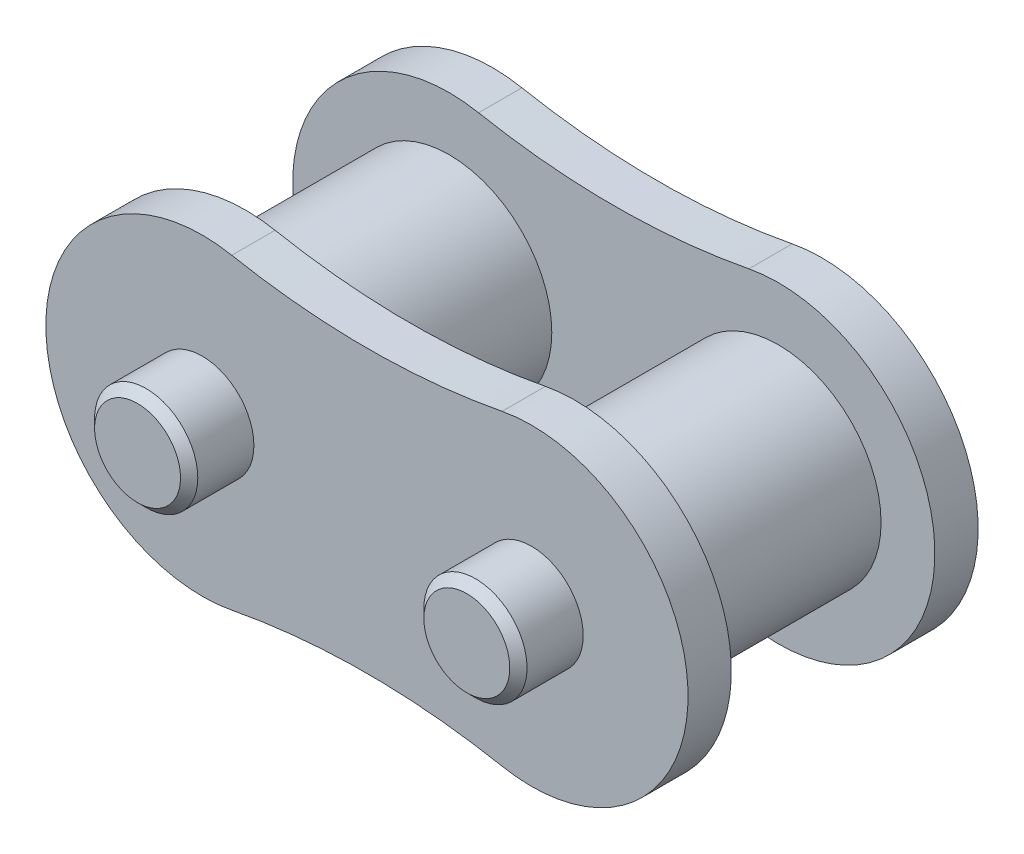
ISO-10303-21;
HEADER;
FILE_DESCRIPTION(('STEP AP214'),'2;1');
FILE_NAME('part.step','',(''),(''),'','','');
FILE_SCHEMA(('AUTOMOTIVE_DESIGN { 1 0 10303 214 1 1 1 1 }'));
ENDSEC;
DATA;
#1=APPLICATION_CONTEXT('core data for automotive mechanical design processes');
#2=APPLICATION_PROTOCOL_DEFINITION('international standard','automotive_design',2000,#1);
#3=PRODUCT_CONTEXT('',#1,'mechanical');
#4=PRODUCT('Part','Part','',(#3));
#5=PRODUCT_RELATED_PRODUCT_CATEGORY('part','',(#4));
#6=PRODUCT_DEFINITION_FORMATION('','',#4);
#7=PRODUCT_DEFINITION_CONTEXT('part definition',#1,'design');
#8=PRODUCT_DEFINITION('design','',#6,#7);
#9=PRODUCT_DEFINITION_SHAPE('','',#8);
#10=(LENGTH_UNIT() NAMED_UNIT(*) SI_UNIT(.MILLI.,.METRE.));
#11=(NAMED_UNIT(*) PLANE_ANGLE_UNIT() SI_UNIT($,.RADIAN.));
#12=(NAMED_UNIT(*) SI_UNIT($,.STERADIAN.) SOLID_ANGLE_UNIT());
#13=UNCERTAINTY_MEASURE_WITH_UNIT(LENGTH_MEASURE(1.E-05),#10,'distance_accuracy_value','');
#14=(GEOMETRIC_REPRESENTATION_CONTEXT(3) GLOBAL_UNCERTAINTY_ASSIGNED_CONTEXT((#13)) GLOBAL_UNIT_ASSIGNED_CONTEXT((#10,
#11,#12)) REPRESENTATION_CONTEXT('',''));
#15=CARTESIAN_POINT('',(0.,0.,0.));
#16=DIRECTION('',(0.,0.,1.));
#17=DIRECTION('',(1.,0.,0.));
#18=AXIS2_PLACEMENT_3D('',#15,#16,#17);
#19=CARTESIAN_POINT('',(-3.175,-16.552728976802,5.595));
#20=DIRECTION('',(0.,0.,1.));
#21=DIRECTION('',(1.,0.,0.));
#22=AXIS2_PLACEMENT_3D('',#19,#20,#21);
#23=PLANE('',#22);
#24=CARTESIAN_POINT('',(6.35,0.,5.595));
#25=DIRECTION('',(0.,0.,1.));
#26=DIRECTION('',(1.,0.,0.));
#27=AXIS2_PLACEMENT_3D('',#24,#25,#26);
#28=CIRCLE('',#27,1.99);
#29=CARTESIAN_POINT('',(8.34,0.,5.595));
#30=VERTEX_POINT('',#29);
#31=EDGE_CURVE('E186',#30,#30,#28,.T.);
#32=ORIENTED_EDGE('',*,*,#31,.F.);
#33=EDGE_LOOP('',(#32));
#34=FACE_BOUND('',#33,.T.);
#35=CARTESIAN_POINT('',(0.,-33.105457953604,5.595));
#36=DIRECTION('',(0.,0.,-1.));
#37=DIRECTION('',(1.,0.,0.));
#38=AXIS2_PLACEMENT_3D('',#35,#36,#37);
#39=CIRCLE('',#38,27.673957953604);
#40=CARTESIAN_POINT('',(-5.21314343941615,-5.92695386861222,5.595));
#41=VERTEX_POINT('',#40);
#42=CARTESIAN_POINT('',(5.21314343941615,-5.92695386861222,5.595));
#43=VERTEX_POINT('',#42);
#44=EDGE_CURVE('E191',#41,#43,#39,.T.);
#45=ORIENTED_EDGE('',*,*,#44,.T.);
#46=CARTESIAN_POINT('',(6.35,0.,5.595));
#47=DIRECTION('',(0.,0.,1.));
#48=DIRECTION('',(1.,0.,0.));
#49=AXIS2_PLACEMENT_3D('',#46,#47,#48);
#50=CIRCLE('',#49,6.03499999999999);
#51=CARTESIAN_POINT('',(5.21314343941614,5.92695386861222,5.595));
#52=VERTEX_POINT('',#51);
#53=EDGE_CURVE('E93',#43,#52,#50,.T.);
#54=ORIENTED_EDGE('',*,*,#53,.T.);
#55=CARTESIAN_POINT('',(0.,33.105457953604,5.595));
#56=DIRECTION('',(0.,0.,-1.));
#57=DIRECTION('',(1.,0.,0.));
#58=AXIS2_PLACEMENT_3D('',#55,#56,#57);
#59=CIRCLE('',#58,27.673957953604);
#60=CARTESIAN_POINT('',(-5.21314343941615,5.92695386861222,5.595));
#61=VERTEX_POINT('',#60);
#62=EDGE_CURVE('E196',#52,#61,#59,.T.);
#63=ORIENTED_EDGE('',*,*,#62,.T.);
#64=CARTESIAN_POINT('',(-6.35,0.,5.595));
#65=DIRECTION('',(0.,0.,1.));
#66=DIRECTION('',(1.,0.,0.));
#67=AXIS2_PLACEMENT_3D('',#64,#65,#66);
#68=CIRCLE('',#67,6.03499999999999);
#69=EDGE_CURVE('E61',#61,#41,#68,.T.);
#70=ORIENTED_EDGE('',*,*,#69,.T.);
#71=EDGE_LOOP('',(#45,#54,#63,#70));
#72=FACE_BOUND('',#71,.T.);
#73=CARTESIAN_POINT('',(-6.35,0.,5.595));
#74=DIRECTION('',(0.,0.,1.));
#75=DIRECTION('',(1.,0.,0.));
#76=AXIS2_PLACEMENT_3D('',#73,#74,#75);
#77=CIRCLE('',#76,1.99);
#78=CARTESIAN_POINT('',(-4.36,0.,5.595));
#79=VERTEX_POINT('',#78);
#80=EDGE_CURVE('E182',#79,#79,#77,.T.);
#81=ORIENTED_EDGE('',*,*,#80,.F.);
#82=EDGE_LOOP('',(#81));
#83=FACE_BOUND('',#82,.T.);
#84=ADVANCED_FACE('F43',(#34,#72,#83),#23,.T.);
#85=CARTESIAN_POINT('',(-3.175,-16.552728976802,3.925));
#86=DIRECTION('',(0.,0.,1.));
#87=DIRECTION('',(1.,0.,0.));
#88=AXIS2_PLACEMENT_3D('',#85,#86,#87);
#89=PLANE('',#88);
#90=CARTESIAN_POINT('',(0.,-33.105457953604,3.925));
#91=DIRECTION('',(0.,0.,-1.));
#92=DIRECTION('',(1.,0.,0.));
#93=AXIS2_PLACEMENT_3D('',#90,#91,#92);
#94=CIRCLE('',#93,27.673957953604);
#95=CARTESIAN_POINT('',(-5.21314343941615,-5.92695386861222,3.925));
#96=VERTEX_POINT('',#95);
#97=CARTESIAN_POINT('',(5.21314343941615,-5.92695386861222,3.925));
#98=VERTEX_POINT('',#97);
#99=EDGE_CURVE('E190',#96,#98,#94,.T.);
#100=ORIENTED_EDGE('',*,*,#99,.F.);
#101=CARTESIAN_POINT('',(-6.35,0.,3.925));
#102=DIRECTION('',(0.,0.,1.));
#103=DIRECTION('',(1.,0.,0.));
#104=AXIS2_PLACEMENT_3D('',#101,#102,#103);
#105=CIRCLE('',#104,6.03499999999999);
#106=CARTESIAN_POINT('',(-5.21314343941615,5.92695386861222,3.925));
#107=VERTEX_POINT('',#106);
#108=EDGE_CURVE('E85',#107,#96,#105,.T.);
#109=ORIENTED_EDGE('',*,*,#108,.F.);
#110=CARTESIAN_POINT('',(0.,33.105457953604,3.925));
#111=DIRECTION('',(0.,0.,-1.));
#112=DIRECTION('',(1.,0.,0.));
#113=AXIS2_PLACEMENT_3D('',#110,#111,#112);
#114=CIRCLE('',#113,27.673957953604);
#115=CARTESIAN_POINT('',(5.21314343941614,5.92695386861222,3.925));
#116=VERTEX_POINT('',#115);
#117=EDGE_CURVE('E79',#116,#107,#114,.T.);
#118=ORIENTED_EDGE('',*,*,#117,.F.);
#119=CARTESIAN_POINT('',(6.35,0.,3.925));
#120=DIRECTION('',(0.,0.,1.));
#121=DIRECTION('',(1.,0.,0.));
#122=AXIS2_PLACEMENT_3D('',#119,#120,#121);
#123=CIRCLE('',#122,6.03499999999999);
#124=EDGE_CURVE('E205',#98,#116,#123,.T.);
#125=ORIENTED_EDGE('',*,*,#124,.F.);
#126=EDGE_LOOP('',(#100,#109,#118,#125));
#127=FACE_BOUND('',#126,.T.);
#128=CARTESIAN_POINT('',(6.35,0.,3.925));
#129=DIRECTION('',(0.,0.,1.));
#130=DIRECTION('',(1.,0.,0.));
#131=AXIS2_PLACEMENT_3D('',#128,#129,#130);
#132=CIRCLE('',#131,3.96);
#133=CARTESIAN_POINT('',(10.31,0.,3.925));
#134=VERTEX_POINT('',#133);
#135=EDGE_CURVE('E223',#134,#134,#132,.T.);
#136=ORIENTED_EDGE('',*,*,#135,.T.);
#137=EDGE_LOOP('',(#136));
#138=FACE_BOUND('',#137,.T.);
#139=CARTESIAN_POINT('',(-6.35,0.,3.925));
#140=DIRECTION('',(0.,0.,1.));
#141=DIRECTION('',(1.,0.,0.));
#142=AXIS2_PLACEMENT_3D('',#139,#140,#141);
#143=CIRCLE('',#142,3.96);
#144=CARTESIAN_POINT('',(-2.39,0.,3.925));
#145=VERTEX_POINT('',#144);
#146=EDGE_CURVE('E227',#145,#145,#143,.F.);
#147=ORIENTED_EDGE('',*,*,#146,.F.);
#148=EDGE_LOOP('',(#147));
#149=FACE_BOUND('',#148,.T.);
#150=ADVANCED_FACE('F279',(#127,#138,#149),#89,.F.);
#151=CARTESIAN_POINT('',(6.35,0.,3.925));
#152=DIRECTION('',(0.,0.,-1.));
#153=DIRECTION('',(-1.,0.,0.));
#154=AXIS2_PLACEMENT_3D('',#151,#152,#153);
#155=CYLINDRICAL_SURFACE('',#154,3.96);
#156=ORIENTED_EDGE('',*,*,#135,.F.);
#157=EDGE_LOOP('',(#156));
#158=FACE_BOUND('',#157,.T.);
#159=CARTESIAN_POINT('',(6.35,0.,-3.925));
#160=DIRECTION('',(0.,0.,-1.));
#161=DIRECTION('',(-1.,0.,0.));
#162=AXIS2_PLACEMENT_3D('',#159,#160,#161);
#163=CIRCLE('',#162,3.96);
#164=CARTESIAN_POINT('',(2.39,0.,-3.925));
#165=VERTEX_POINT('',#164);
#166=EDGE_CURVE('E178',#165,#165,#163,.T.);
#167=ORIENTED_EDGE('',*,*,#166,.F.);
#168=EDGE_LOOP('',(#167));
#169=FACE_BOUND('',#168,.T.);
#170=ADVANCED_FACE('F285',(#158,#169),#155,.T.);
#171=CARTESIAN_POINT('',(0.,-33.105457953604,5.595));
#172=DIRECTION('',(0.,0.,-1.));
#173=DIRECTION('',(-1.,0.,0.));
#174=AXIS2_PLACEMENT_3D('',#171,#172,#173);
#175=CYLINDRICAL_SURFACE('',#174,27.673957953604);
#176=ORIENTED_EDGE('',*,*,#99,.T.);
#177=DIRECTION('',(0.,0.,-1.));
#178=VECTOR('',#177,1.);
#179=CARTESIAN_POINT('',(5.21314343941615,-5.92695386861222,5.595));
#180=LINE('',#179,#178);
#181=EDGE_CURVE('E220',#43,#98,#180,.T.);
#182=ORIENTED_EDGE('',*,*,#181,.F.);
#183=ORIENTED_EDGE('',*,*,#44,.F.);
#184=DIRECTION('',(0.,0.,-1.));
#185=VECTOR('',#184,1.);
#186=CARTESIAN_POINT('',(-5.21314343941615,-5.92695386861222,5.595));
#187=LINE('',#186,#185);
#188=EDGE_CURVE('E201',#41,#96,#187,.T.);
#189=ORIENTED_EDGE('',*,*,#188,.T.);
#190=EDGE_LOOP('',(#176,#182,#183,#189));
#191=FACE_BOUND('',#190,.T.);
#192=ADVANCED_FACE('F302',(#191),#175,.F.);
#193=CARTESIAN_POINT('',(6.35,0.,5.595));
#194=DIRECTION('',(0.,0.,-1.));
#195=DIRECTION('',(-1.,0.,0.));
#196=AXIS2_PLACEMENT_3D('',#193,#194,#195);
#197=CYLINDRICAL_SURFACE('',#196,6.03499999999999);
#198=ORIENTED_EDGE('',*,*,#124,.T.);
#199=DIRECTION('',(0.,0.,-1.));
#200=VECTOR('',#199,1.);
#201=CARTESIAN_POINT('',(5.21314343941614,5.92695386861222,5.595));
#202=LINE('',#201,#200);
#203=EDGE_CURVE('E217',#52,#116,#202,.T.);
#204=ORIENTED_EDGE('',*,*,#203,.F.);
#205=ORIENTED_EDGE('',*,*,#53,.F.);
#206=ORIENTED_EDGE('',*,*,#181,.T.);
#207=EDGE_LOOP('',(#198,#204,#205,#206));
#208=FACE_BOUND('',#207,.T.);
#209=ADVANCED_FACE('F299',(#208),#197,.T.);
#210=CARTESIAN_POINT('',(0.,33.105457953604,5.595));
#211=DIRECTION('',(0.,0.,-1.));
#212=DIRECTION('',(-1.,0.,0.));
#213=AXIS2_PLACEMENT_3D('',#210,#211,#212);
#214=CYLINDRICAL_SURFACE('',#213,27.673957953604);
#215=ORIENTED_EDGE('',*,*,#117,.T.);
#216=DIRECTION('',(0.,0.,-1.));
#217=VECTOR('',#216,1.);
#218=CARTESIAN_POINT('',(-5.21314343941615,5.92695386861222,5.595));
#219=LINE('',#218,#217);
#220=EDGE_CURVE('E214',#61,#107,#219,.T.);
#221=ORIENTED_EDGE('',*,*,#220,.F.);
#222=ORIENTED_EDGE('',*,*,#62,.F.);
#223=ORIENTED_EDGE('',*,*,#203,.T.);
#224=EDGE_LOOP('',(#215,#221,#222,#223));
#225=FACE_BOUND('',#224,.T.);
#226=ADVANCED_FACE('F296',(#225),#214,.F.);
#227=CARTESIAN_POINT('',(-6.35,0.,5.595));
#228=DIRECTION('',(0.,0.,-1.));
#229=DIRECTION('',(-1.,0.,0.));
#230=AXIS2_PLACEMENT_3D('',#227,#228,#229);
#231=CYLINDRICAL_SURFACE('',#230,6.03499999999999);
#232=ORIENTED_EDGE('',*,*,#108,.T.);
#233=ORIENTED_EDGE('',*,*,#188,.F.);
#234=ORIENTED_EDGE('',*,*,#69,.F.);
#235=ORIENTED_EDGE('',*,*,#220,.T.);
#236=EDGE_LOOP('',(#232,#233,#234,#235));
#237=FACE_BOUND('',#236,.T.);
#238=ADVANCED_FACE('F293',(#237),#231,.T.);
#239=CARTESIAN_POINT('',(-6.35,0.,3.925));
#240=DIRECTION('',(0.,0.,-1.));
#241=DIRECTION('',(-1.,0.,0.));
#242=AXIS2_PLACEMENT_3D('',#239,#240,#241);
#243=CYLINDRICAL_SURFACE('',#242,3.96);
#244=ORIENTED_EDGE('',*,*,#146,.T.);
#245=EDGE_LOOP('',(#244));
#246=FACE_BOUND('',#245,.T.);
#247=CARTESIAN_POINT('',(-6.35,0.,-3.925));
#248=DIRECTION('',(0.,0.,-1.));
#249=DIRECTION('',(-1.,0.,0.));
#250=AXIS2_PLACEMENT_3D('',#247,#248,#249);
#251=CIRCLE('',#250,3.96);
#252=CARTESIAN_POINT('',(-10.31,0.,-3.925));
#253=VERTEX_POINT('',#252);
#254=EDGE_CURVE('E132',#253,#253,#251,.T.);
#255=ORIENTED_EDGE('',*,*,#254,.F.);
#256=EDGE_LOOP('',(#255));
#257=FACE_BOUND('',#256,.T.);
#258=ADVANCED_FACE('F290',(#246,#257),#243,.T.);
#259=CARTESIAN_POINT('',(6.35,0.,8.0925));
#260=DIRECTION('',(0.,0.,-1.));
#261=DIRECTION('',(-1.,0.,0.));
#262=AXIS2_PLACEMENT_3D('',#259,#260,#261);
#263=CYLINDRICAL_SURFACE('',#262,1.99);
#264=CARTESIAN_POINT('',(6.35,0.,7.7595));
#265=DIRECTION('',(0.,0.,1.));
#266=DIRECTION('',(1.,0.,0.));
#267=AXIS2_PLACEMENT_3D('',#264,#265,#266);
#268=CIRCLE('',#267,1.99);
#269=CARTESIAN_POINT('',(4.36,0.,7.7595));
#270=VERTEX_POINT('',#269);
#271=EDGE_CURVE('E235',#270,#270,#268,.F.);
#272=ORIENTED_EDGE('',*,*,#271,.T.);
#273=EDGE_LOOP('',(#272));
#274=FACE_BOUND('',#273,.T.);
#275=ORIENTED_EDGE('',*,*,#31,.T.);
#276=EDGE_LOOP('',(#275));
#277=FACE_BOUND('',#276,.T.);
#278=ADVANCED_FACE('F340',(#274,#277),#263,.T.);
#279=CARTESIAN_POINT('',(6.35,0.,8.0925));
#280=DIRECTION('',(0.,0.,1.));
#281=DIRECTION('',(1.,0.,0.));
#282=AXIS2_PLACEMENT_3D('',#279,#280,#281);
#283=PLANE('',#282);
#284=CARTESIAN_POINT('',(6.35,0.,8.0925));
#285=DIRECTION('',(0.,0.,1.));
#286=DIRECTION('',(1.,0.,0.));
#287=AXIS2_PLACEMENT_3D('',#284,#285,#286);
#288=CIRCLE('',#287,1.657);
#289=CARTESIAN_POINT('',(4.693,0.,8.0925));
#290=VERTEX_POINT('',#289);
#291=EDGE_CURVE('E231',#290,#290,#288,.T.);
#292=ORIENTED_EDGE('',*,*,#291,.T.);
#293=EDGE_LOOP('',(#292));
#294=FACE_BOUND('',#293,.T.);
#295=ADVANCED_FACE('F333',(#294),#283,.T.);
#296=CARTESIAN_POINT('',(-6.35,0.,8.0925));
#297=DIRECTION('',(0.,0.,-1.));
#298=DIRECTION('',(-1.,0.,0.));
#299=AXIS2_PLACEMENT_3D('',#296,#297,#298);
#300=CYLINDRICAL_SURFACE('',#299,1.99);
#301=CARTESIAN_POINT('',(-6.35,0.,7.7595));
#302=DIRECTION('',(0.,0.,1.));
#303=DIRECTION('',(1.,0.,0.));
#304=AXIS2_PLACEMENT_3D('',#301,#302,#303);
#305=CIRCLE('',#304,1.99);
#306=CARTESIAN_POINT('',(-4.36,0.,7.7595));
#307=VERTEX_POINT('',#306);
#308=EDGE_CURVE('E243',#307,#307,#305,.F.);
#309=ORIENTED_EDGE('',*,*,#308,.T.);
#310=EDGE_LOOP('',(#309));
#311=FACE_BOUND('',#310,.T.);
#312=ORIENTED_EDGE('',*,*,#80,.T.);
#313=EDGE_LOOP('',(#312));
#314=FACE_BOUND('',#313,.T.);
#315=ADVANCED_FACE('F328',(#311,#314),#300,.T.);
#316=CARTESIAN_POINT('',(-6.35,0.,8.0925));
#317=DIRECTION('',(0.,0.,1.));
#318=DIRECTION('',(1.,0.,0.));
#319=AXIS2_PLACEMENT_3D('',#316,#317,#318);
#320=PLANE('',#319);
#321=CARTESIAN_POINT('',(-6.35,0.,8.0925));
#322=DIRECTION('',(0.,0.,1.));
#323=DIRECTION('',(1.,0.,0.));
#324=AXIS2_PLACEMENT_3D('',#321,#322,#323);
#325=CIRCLE('',#324,1.657);
#326=CARTESIAN_POINT('',(-4.693,0.,8.0925));
#327=VERTEX_POINT('',#326);
#328=EDGE_CURVE('E239',#327,#327,#325,.T.);
#329=ORIENTED_EDGE('',*,*,#328,.T.);
#330=EDGE_LOOP('',(#329));
#331=FACE_BOUND('',#330,.T.);
#332=ADVANCED_FACE('F313',(#331),#320,.T.);
#333=CARTESIAN_POINT('',(6.35,0.,8.0925));
#334=DIRECTION('',(0.,0.,-1.));
#335=DIRECTION('',(-1.,0.,0.));
#336=AXIS2_PLACEMENT_3D('',#333,#334,#335);
#337=CONICAL_SURFACE('',#336,1.657,0.785398163397443);
#338=CARTESIAN_POINT('',(4.36,0.,7.7595));
#339=CARTESIAN_POINT('',(4.36346875,0.,7.76296875));
#340=CARTESIAN_POINT('',(4.3669375,0.,7.7664375));
#341=CARTESIAN_POINT('',(4.373875,0.,7.773375));
#342=CARTESIAN_POINT('',(4.37734375,0.,7.77684375));
#343=CARTESIAN_POINT('',(4.38428125,0.,7.78378125));
#344=CARTESIAN_POINT('',(4.38775,0.,7.78725));
#345=CARTESIAN_POINT('',(4.3946875,0.,7.7941875));
#346=CARTESIAN_POINT('',(4.39815625,0.,7.79765625));
#347=CARTESIAN_POINT('',(4.40509375,0.,7.80459375));
#348=CARTESIAN_POINT('',(4.4085625,0.,7.8080625));
#349=CARTESIAN_POINT('',(4.4155,0.,7.815));
#350=CARTESIAN_POINT('',(4.41896875,0.,7.81846875));
#351=CARTESIAN_POINT('',(4.42590625,0.,7.82540625));
#352=CARTESIAN_POINT('',(4.429375,0.,7.828875));
#353=CARTESIAN_POINT('',(4.4363125,0.,7.8358125));
#354=CARTESIAN_POINT('',(4.43978125,0.,7.83928125));
#355=CARTESIAN_POINT('',(4.44671875,0.,7.84621875));
#356=CARTESIAN_POINT('',(4.4501875,0.,7.8496875));
#357=CARTESIAN_POINT('',(4.457125,0.,7.856625));
#358=CARTESIAN_POINT('',(4.46059375,0.,7.86009375));
#359=CARTESIAN_POINT('',(4.46753125,0.,7.86703125));
#360=CARTESIAN_POINT('',(4.471,0.,7.8705));
#361=CARTESIAN_POINT('',(4.4779375,0.,7.8774375));
#362=CARTESIAN_POINT('',(4.48140625,0.,7.88090625));
#363=CARTESIAN_POINT('',(4.48834375,0.,7.88784375));
#364=CARTESIAN_POINT('',(4.4918125,0.,7.8913125));
#365=CARTESIAN_POINT('',(4.49875,0.,7.89825));
#366=CARTESIAN_POINT('',(4.50221875,0.,7.90171875));
#367=CARTESIAN_POINT('',(4.50915625,0.,7.90865625));
#368=CARTESIAN_POINT('',(4.512625,0.,7.912125));
#369=CARTESIAN_POINT('',(4.5195625,0.,7.9190625));
#370=CARTESIAN_POINT('',(4.52303125,0.,7.92253125));
#371=CARTESIAN_POINT('',(4.52996875,0.,7.92946875));
#372=CARTESIAN_POINT('',(4.5334375,0.,7.9329375));
#373=CARTESIAN_POINT('',(4.540375,0.,7.939875));
#374=CARTESIAN_POINT('',(4.54384375,0.,7.94334375));
#375=CARTESIAN_POINT('',(4.55078125,0.,7.95028125));
#376=CARTESIAN_POINT('',(4.55425,0.,7.95375));
#377=CARTESIAN_POINT('',(4.5611875,0.,7.9606875));
#378=CARTESIAN_POINT('',(4.56465625,0.,7.96415625));
#379=CARTESIAN_POINT('',(4.57159375,0.,7.97109375));
#380=CARTESIAN_POINT('',(4.5750625,0.,7.9745625));
#381=CARTESIAN_POINT('',(4.582,0.,7.9815));
#382=CARTESIAN_POINT('',(4.58546875,0.,7.98496875));
#383=CARTESIAN_POINT('',(4.59240625,0.,7.99190625));
#384=CARTESIAN_POINT('',(4.595875,0.,7.995375));
#385=CARTESIAN_POINT('',(4.6028125,0.,8.0023125));
#386=CARTESIAN_POINT('',(4.60628125,0.,8.00578125));
#387=CARTESIAN_POINT('',(4.61321875,0.,8.01271875));
#388=CARTESIAN_POINT('',(4.6166875,0.,8.0161875));
#389=CARTESIAN_POINT('',(4.623625,0.,8.023125));
#390=CARTESIAN_POINT('',(4.62709375,0.,8.02659375));
#391=CARTESIAN_POINT('',(4.63403125,0.,8.03353125));
#392=CARTESIAN_POINT('',(4.6375,0.,8.037));
#393=CARTESIAN_POINT('',(4.6444375,0.,8.0439375));
#394=CARTESIAN_POINT('',(4.64790625,0.,8.04740625));
#395=CARTESIAN_POINT('',(4.65484375,0.,8.05434375));
#396=CARTESIAN_POINT('',(4.6583125,0.,8.0578125));
#397=CARTESIAN_POINT('',(4.66525,0.,8.06475));
#398=CARTESIAN_POINT('',(4.66871875,0.,8.06821875));
#399=CARTESIAN_POINT('',(4.67565625,0.,8.07515625));
#400=CARTESIAN_POINT('',(4.679125,0.,8.078625));
#401=CARTESIAN_POINT('',(4.6860625,0.,8.0855625));
#402=CARTESIAN_POINT('',(4.68953125,0.,8.08903125));
#403=CARTESIAN_POINT('',(4.693,0.,8.0925));
#404=B_SPLINE_CURVE_WITH_KNOTS('',3,(#338,#339,#340,#341,#342,#343,#344,#345,#346,#347,#348,
#349,#350,#351,#352,#353,#354,#355,#356,#357,#358,#359,#360,#361,#362,#363,#364,#365,#366,#367,
#368,#369,#370,#371,#372,#373,#374,#375,#376,#377,#378,#379,#380,#381,#382,#383,#384,#385,#386,
#387,#388,#389,#390,#391,#392,#393,#394,#395,#396,#397,#398,#399,#400,#401,#402,#403),
.UNSPECIFIED.,.F.,.F.,(4,2,2,2,2,2,2,2,2,2,2,2,2,2,2,2,2,2,2,2,2,2,2,2,2,2,2,2,2,2,2,2,4),(0.,
0.0147166598834456,0.0294333197668907,0.0441499796503357,0.0588666395337807,0.0735832994172257,
0.0882999593006707,0.103016619184115,0.117733279067561,0.132449938951005,0.147166598834451,
0.161883258717895,0.176599918601341,0.191316578484786,0.206033238368231,0.220749898251676,
0.23546655813512,0.250183218018566,0.26489987790201,0.279616537785456,0.2943331976689,
0.309049857552346,0.32376651743579,0.338483177319236,0.35319983720268,0.367916497086126,
0.38263315696957,0.397349816853016,0.41206647673646,0.426783136619906,0.44149979650335,
0.456216456386796,0.470933116270241),.UNSPECIFIED.);
#405=EDGE_CURVE('BSEAM309',#270,#290,#404,.T.);
#406=ORIENTED_EDGE('',*,*,#271,.F.);
#407=ORIENTED_EDGE('',*,*,#291,.F.);
#408=ORIENTED_EDGE('',*,*,#405,.T.);
#409=ORIENTED_EDGE('',*,*,#405,.F.);
#410=EDGE_LOOP('',(#406,#408,#407,#409));
#411=FACE_BOUND('',#410,.T.);
#412=ADVANCED_FACE('F309',(#411),#337,.T.);
#413=CARTESIAN_POINT('',(-6.35,0.,8.0925));
#414=DIRECTION('',(0.,0.,-1.));
#415=DIRECTION('',(-1.,0.,0.));
#416=AXIS2_PLACEMENT_3D('',#413,#414,#415);
#417=CONICAL_SURFACE('',#416,1.657,0.785398163397442);
#418=ORIENTED_EDGE('',*,*,#308,.F.);
#419=EDGE_LOOP('',(#418));
#420=FACE_BOUND('',#419,.T.);
#421=ORIENTED_EDGE('',*,*,#328,.F.);
#422=EDGE_LOOP('',(#421));
#423=FACE_BOUND('',#422,.T.);
#424=ADVANCED_FACE('F312',(#420,#423),#417,.T.);
#425=CARTESIAN_POINT('',(-3.175,-16.552728976802,-3.925));
#426=DIRECTION('',(0.,0.,-1.));
#427=DIRECTION('',(1.,0.,0.));
#428=AXIS2_PLACEMENT_3D('',#425,#426,#427);
#429=PLANE('',#428);
#430=ORIENTED_EDGE('',*,*,#254,.T.);
#431=EDGE_LOOP('',(#430));
#432=FACE_BOUND('',#431,.T.);
#433=CARTESIAN_POINT('',(0.,-33.105457953604,-3.925));
#434=DIRECTION('',(0.,0.,-1.));
#435=DIRECTION('',(1.,0.,0.));
#436=AXIS2_PLACEMENT_3D('',#433,#434,#435);
#437=CIRCLE('',#436,27.673957953604);
#438=CARTESIAN_POINT('',(-5.21314343941615,-5.92695386861222,-3.925));
#439=VERTEX_POINT('',#438);
#440=CARTESIAN_POINT('',(5.21314343941615,-5.92695386861222,-3.925));
#441=VERTEX_POINT('',#440);
#442=EDGE_CURVE('E126',#439,#441,#437,.T.);
#443=ORIENTED_EDGE('',*,*,#442,.T.);
#444=CARTESIAN_POINT('',(6.35,0.,-3.925));
#445=DIRECTION('',(0.,0.,1.));
#446=DIRECTION('',(1.,0.,0.));
#447=AXIS2_PLACEMENT_3D('',#444,#445,#446);
#448=CIRCLE('',#447,6.03499999999999);
#449=CARTESIAN_POINT('',(5.21314343941614,5.92695386861222,-3.925));
#450=VERTEX_POINT('',#449);
#451=EDGE_CURVE('E144',#441,#450,#448,.T.);
#452=ORIENTED_EDGE('',*,*,#451,.T.);
#453=CARTESIAN_POINT('',(0.,33.105457953604,-3.925));
#454=DIRECTION('',(0.,0.,-1.));
#455=DIRECTION('',(1.,0.,0.));
#456=AXIS2_PLACEMENT_3D('',#453,#454,#455);
#457=CIRCLE('',#456,27.673957953604);
#458=CARTESIAN_POINT('',(-5.21314343941615,5.92695386861222,-3.925));
#459=VERTEX_POINT('',#458);
#460=EDGE_CURVE('E161',#450,#459,#457,.T.);
#461=ORIENTED_EDGE('',*,*,#460,.T.);
#462=CARTESIAN_POINT('',(-6.35,0.,-3.925));
#463=DIRECTION('',(0.,0.,1.));
#464=DIRECTION('',(1.,0.,0.));
#465=AXIS2_PLACEMENT_3D('',#462,#463,#464);
#466=CIRCLE('',#465,6.03499999999999);
#467=EDGE_CURVE('E158',#459,#439,#466,.T.);
#468=ORIENTED_EDGE('',*,*,#467,.T.);
#469=EDGE_LOOP('',(#443,#452,#461,#468));
#470=FACE_BOUND('',#469,.T.);
#471=ORIENTED_EDGE('',*,*,#166,.T.);
#472=EDGE_LOOP('',(#471));
#473=FACE_BOUND('',#472,.T.);
#474=ADVANCED_FACE('F316',(#432,#470,#473),#429,.F.);
#475=CARTESIAN_POINT('',(0.,-33.105457953604,-5.595));
#476=DIRECTION('',(0.,0.,1.));
#477=DIRECTION('',(1.,0.,0.));
#478=AXIS2_PLACEMENT_3D('',#475,#476,#477);
#479=CYLINDRICAL_SURFACE('',#478,27.673957953604);
#480=ORIENTED_EDGE('',*,*,#442,.F.);
#481=DIRECTION('',(0.,0.,1.));
#482=VECTOR('',#481,1.);
#483=CARTESIAN_POINT('',(-5.21314343941615,-5.92695386861222,-5.595));
#484=LINE('',#483,#482);
#485=CARTESIAN_POINT('',(-5.21314343941615,-5.92695386861222,-5.595));
#486=VERTEX_POINT('',#485);
#487=EDGE_CURVE('E120',#486,#439,#484,.T.);
#488=ORIENTED_EDGE('',*,*,#487,.F.);
#489=CARTESIAN_POINT('',(0.,-33.105457953604,-5.595));
#490=DIRECTION('',(0.,0.,-1.));
#491=DIRECTION('',(1.,0.,0.));
#492=AXIS2_PLACEMENT_3D('',#489,#490,#491);
#493=CIRCLE('',#492,27.673957953604);
#494=CARTESIAN_POINT('',(5.21314343941615,-5.92695386861222,-5.595));
#495=VERTEX_POINT('',#494);
#496=EDGE_CURVE('E123',#486,#495,#493,.T.);
#497=ORIENTED_EDGE('',*,*,#496,.T.);
#498=DIRECTION('',(0.,0.,1.));
#499=VECTOR('',#498,1.);
#500=CARTESIAN_POINT('',(5.21314343941615,-5.92695386861222,-5.595));
#501=LINE('',#500,#499);
#502=EDGE_CURVE('E155',#495,#441,#501,.T.);
#503=ORIENTED_EDGE('',*,*,#502,.T.);
#504=EDGE_LOOP('',(#480,#488,#497,#503));
#505=FACE_BOUND('',#504,.T.);
#506=ADVANCED_FACE('F122',(#505),#479,.F.);
#507=CARTESIAN_POINT('',(-6.35,0.,-5.595));
#508=DIRECTION('',(0.,0.,1.));
#509=DIRECTION('',(1.,0.,0.));
#510=AXIS2_PLACEMENT_3D('',#507,#508,#509);
#511=CYLINDRICAL_SURFACE('',#510,6.03499999999999);
#512=ORIENTED_EDGE('',*,*,#467,.F.);
#513=DIRECTION('',(0.,0.,1.));
#514=VECTOR('',#513,1.);
#515=CARTESIAN_POINT('',(-5.21314343941615,5.92695386861222,-5.595));
#516=LINE('',#515,#514);
#517=CARTESIAN_POINT('',(-5.21314343941615,5.92695386861222,-5.595));
#518=VERTEX_POINT('',#517);
#519=EDGE_CURVE('E133',#518,#459,#516,.T.);
#520=ORIENTED_EDGE('',*,*,#519,.F.);
#521=CARTESIAN_POINT('',(-6.35,0.,-5.595));
#522=DIRECTION('',(0.,0.,1.));
#523=DIRECTION('',(1.,0.,0.));
#524=AXIS2_PLACEMENT_3D('',#521,#522,#523);
#525=CIRCLE('',#524,6.03499999999999);
#526=EDGE_CURVE('E139',#518,#486,#525,.T.);
#527=ORIENTED_EDGE('',*,*,#526,.T.);
#528=ORIENTED_EDGE('',*,*,#487,.T.);
#529=EDGE_LOOP('',(#512,#520,#527,#528));
#530=FACE_BOUND('',#529,.T.);
#531=ADVANCED_FACE('F146',(#530),#511,.T.);
#532=CARTESIAN_POINT('',(0.,33.105457953604,-5.595));
#533=DIRECTION('',(0.,0.,1.));
#534=DIRECTION('',(1.,0.,0.));
#535=AXIS2_PLACEMENT_3D('',#532,#533,#534);
#536=CYLINDRICAL_SURFACE('',#535,27.673957953604);
#537=ORIENTED_EDGE('',*,*,#460,.F.);
#538=DIRECTION('',(0.,0.,1.));
#539=VECTOR('',#538,1.);
#540=CARTESIAN_POINT('',(5.21314343941614,5.92695386861222,-5.595));
#541=LINE('',#540,#539);
#542=CARTESIAN_POINT('',(5.21314343941614,5.92695386861222,-5.595));
#543=VERTEX_POINT('',#542);
#544=EDGE_CURVE('E170',#543,#450,#541,.T.);
#545=ORIENTED_EDGE('',*,*,#544,.F.);
#546=CARTESIAN_POINT('',(0.,33.105457953604,-5.595));
#547=DIRECTION('',(0.,0.,-1.));
#548=DIRECTION('',(1.,0.,0.));
#549=AXIS2_PLACEMENT_3D('',#546,#547,#548);
#550=CIRCLE('',#549,27.673957953604);
#551=EDGE_CURVE('E148',#543,#518,#550,.T.);
#552=ORIENTED_EDGE('',*,*,#551,.T.);
#553=ORIENTED_EDGE('',*,*,#519,.T.);
#554=EDGE_LOOP('',(#537,#545,#552,#553));
#555=FACE_BOUND('',#554,.T.);
#556=ADVANCED_FACE('F366',(#555),#536,.F.);
#557=CARTESIAN_POINT('',(6.35,0.,-5.595));
#558=DIRECTION('',(0.,0.,1.));
#559=DIRECTION('',(1.,0.,0.));
#560=AXIS2_PLACEMENT_3D('',#557,#558,#559);
#561=CYLINDRICAL_SURFACE('',#560,6.03499999999999);
#562=ORIENTED_EDGE('',*,*,#451,.F.);
#563=ORIENTED_EDGE('',*,*,#502,.F.);
#564=CARTESIAN_POINT('',(6.35,0.,-5.595));
#565=DIRECTION('',(0.,0.,1.));
#566=DIRECTION('',(1.,0.,0.));
#567=AXIS2_PLACEMENT_3D('',#564,#565,#566);
#568=CIRCLE('',#567,6.03499999999999);
#569=EDGE_CURVE('E142',#495,#543,#568,.T.);
#570=ORIENTED_EDGE('',*,*,#569,.T.);
#571=ORIENTED_EDGE('',*,*,#544,.T.);
#572=EDGE_LOOP('',(#562,#563,#570,#571));
#573=FACE_BOUND('',#572,.T.);
#574=ADVANCED_FACE('F363',(#573),#561,.T.);
#575=CARTESIAN_POINT('',(-3.175,-16.552728976802,-5.595));
#576=DIRECTION('',(0.,0.,-1.));
#577=DIRECTION('',(1.,0.,0.));
#578=AXIS2_PLACEMENT_3D('',#575,#576,#577);
#579=PLANE('',#578);
#580=CARTESIAN_POINT('',(-6.35,0.,-5.595));
#581=DIRECTION('',(0.,0.,-1.));
#582=DIRECTION('',(-1.,0.,0.));
#583=AXIS2_PLACEMENT_3D('',#580,#581,#582);
#584=CIRCLE('',#583,1.99);
#585=CARTESIAN_POINT('',(-8.34,0.,-5.595));
#586=VERTEX_POINT('',#585);
#587=EDGE_CURVE('E251',#586,#586,#584,.T.);
#588=ORIENTED_EDGE('',*,*,#587,.F.);
#589=EDGE_LOOP('',(#588));
#590=FACE_BOUND('',#589,.T.);
#591=CARTESIAN_POINT('',(6.35,0.,-5.595));
#592=DIRECTION('',(0.,0.,-1.));
#593=DIRECTION('',(-1.,0.,0.));
#594=AXIS2_PLACEMENT_3D('',#591,#592,#593);
#595=CIRCLE('',#594,1.99);
#596=CARTESIAN_POINT('',(4.36,0.,-5.595));
#597=VERTEX_POINT('',#596);
#598=EDGE_CURVE('E247',#597,#597,#595,.T.);
#599=ORIENTED_EDGE('',*,*,#598,.F.);
#600=EDGE_LOOP('',(#599));
#601=FACE_BOUND('',#600,.T.);
#602=ORIENTED_EDGE('',*,*,#496,.F.);
#603=ORIENTED_EDGE('',*,*,#526,.F.);
#604=ORIENTED_EDGE('',*,*,#551,.F.);
#605=ORIENTED_EDGE('',*,*,#569,.F.);
#606=EDGE_LOOP('',(#602,#603,#604,#605));
#607=FACE_BOUND('',#606,.T.);
#608=ADVANCED_FACE('F137',(#590,#601,#607),#579,.T.);
#609=CARTESIAN_POINT('',(6.35,0.,-8.0925));
#610=DIRECTION('',(0.,0.,1.));
#611=DIRECTION('',(1.,0.,0.));
#612=AXIS2_PLACEMENT_3D('',#609,#610,#611);
#613=CYLINDRICAL_SURFACE('',#612,1.99);
#614=CARTESIAN_POINT('',(6.35,0.,-7.75950000000001));
#615=DIRECTION('',(0.,0.,-1.));
#616=DIRECTION('',(-1.,0.,0.));
#617=AXIS2_PLACEMENT_3D('',#614,#615,#616);
#618=CIRCLE('',#617,1.99);
#619=CARTESIAN_POINT('',(4.36,0.,-7.75950000000001));
#620=VERTEX_POINT('',#619);
#621=EDGE_CURVE('E255',#620,#620,#618,.F.);
#622=ORIENTED_EDGE('',*,*,#621,.T.);
#623=EDGE_LOOP('',(#622));
#624=FACE_BOUND('',#623,.T.);
#625=ORIENTED_EDGE('',*,*,#598,.T.);
#626=EDGE_LOOP('',(#625));
#627=FACE_BOUND('',#626,.T.);
#628=ADVANCED_FACE('F377',(#624,#627),#613,.T.);
#629=CARTESIAN_POINT('',(6.35,0.,-8.0925));
#630=DIRECTION('',(0.,0.,-1.));
#631=DIRECTION('',(1.,0.,0.));
#632=AXIS2_PLACEMENT_3D('',#629,#630,#631);
#633=PLANE('',#632);
#634=CARTESIAN_POINT('',(6.35,0.,-8.0925));
#635=DIRECTION('',(0.,0.,-1.));
#636=DIRECTION('',(-1.,0.,0.));
#637=AXIS2_PLACEMENT_3D('',#634,#635,#636);
#638=CIRCLE('',#637,1.65700000000001);
#639=CARTESIAN_POINT('',(4.69299999999999,0.,-8.0925));
#640=VERTEX_POINT('',#639);
#641=EDGE_CURVE('E259',#640,#640,#638,.T.);
#642=ORIENTED_EDGE('',*,*,#641,.T.);
#643=EDGE_LOOP('',(#642));
#644=FACE_BOUND('',#643,.T.);
#645=ADVANCED_FACE('F381',(#644),#633,.T.);
#646=CARTESIAN_POINT('',(-6.35,0.,-8.0925));
#647=DIRECTION('',(0.,0.,1.));
#648=DIRECTION('',(1.,0.,0.));
#649=AXIS2_PLACEMENT_3D('',#646,#647,#648);
#650=CYLINDRICAL_SURFACE('',#649,1.99);
#651=CARTESIAN_POINT('',(-6.35,0.,-7.75949999999999));
#652=DIRECTION('',(0.,0.,-1.));
#653=DIRECTION('',(-1.,0.,0.));
#654=AXIS2_PLACEMENT_3D('',#651,#652,#653);
#655=CIRCLE('',#654,1.99);
#656=CARTESIAN_POINT('',(-8.34,0.,-7.75949999999999));
#657=VERTEX_POINT('',#656);
#658=EDGE_CURVE('E53',#657,#657,#655,.F.);
#659=ORIENTED_EDGE('',*,*,#658,.T.);
#660=EDGE_LOOP('',(#659));
#661=FACE_BOUND('',#660,.T.);
#662=ORIENTED_EDGE('',*,*,#587,.T.);
#663=EDGE_LOOP('',(#662));
#664=FACE_BOUND('',#663,.T.);
#665=ADVANCED_FACE('F266',(#661,#664),#650,.T.);
#666=CARTESIAN_POINT('',(-6.35,0.,-8.0925));
#667=DIRECTION('',(0.,0.,-1.));
#668=DIRECTION('',(1.,0.,0.));
#669=AXIS2_PLACEMENT_3D('',#666,#667,#668);
#670=PLANE('',#669);
#671=CARTESIAN_POINT('',(-6.35,0.,-8.0925));
#672=DIRECTION('',(0.,0.,-1.));
#673=DIRECTION('',(-1.,0.,0.));
#674=AXIS2_PLACEMENT_3D('',#671,#672,#673);
#675=CIRCLE('',#674,1.657);
#676=CARTESIAN_POINT('',(-8.007,0.,-8.0925));
#677=VERTEX_POINT('',#676);
#678=EDGE_CURVE('E11',#677,#677,#675,.T.);
#679=ORIENTED_EDGE('',*,*,#678,.T.);
#680=EDGE_LOOP('',(#679));
#681=FACE_BOUND('',#680,.T.);
#682=ADVANCED_FACE('F275',(#681),#670,.T.);
#683=CARTESIAN_POINT('',(6.35,0.,-7.75950000000001));
#684=DIRECTION('',(0.,0.,1.));
#685=DIRECTION('',(1.,0.,0.));
#686=AXIS2_PLACEMENT_3D('',#683,#684,#685);
#687=CONICAL_SURFACE('',#686,1.99,0.785398163397453);
#688=ORIENTED_EDGE('',*,*,#641,.F.);
#689=EDGE_LOOP('',(#688));
#690=FACE_BOUND('',#689,.T.);
#691=ORIENTED_EDGE('',*,*,#621,.F.);
#692=EDGE_LOOP('',(#691));
#693=FACE_BOUND('',#692,.T.);
#694=ADVANCED_FACE('F270',(#690,#693),#687,.T.);
#695=CARTESIAN_POINT('',(-6.35,0.,-7.75949999999999));
#696=DIRECTION('',(0.,0.,1.));
#697=DIRECTION('',(1.,0.,0.));
#698=AXIS2_PLACEMENT_3D('',#695,#696,#697);
#699=CONICAL_SURFACE('',#698,1.99,0.785398163397447);
#700=ORIENTED_EDGE('',*,*,#678,.F.);
#701=EDGE_LOOP('',(#700));
#702=FACE_BOUND('',#701,.T.);
#703=ORIENTED_EDGE('',*,*,#658,.F.);
#704=EDGE_LOOP('',(#703));
#705=FACE_BOUND('',#704,.T.);
#706=ADVANCED_FACE('F45',(#702,#705),#699,.T.);
#707=CLOSED_SHELL('',(#84,#150,#170,#192,#209,#226,#238,#258,#278,#295,#315,#332,#412,#424,#474,
#506,#531,#556,#574,#608,#628,#645,#665,#682,#694,#706));
#708=MANIFOLD_SOLID_BREP('B2',#707);
#709=ADVANCED_BREP_SHAPE_REPRESENTATION('',(#18,#708),#14);
#710=SHAPE_DEFINITION_REPRESENTATION(#9,#709);
ENDSEC;
END-ISO-10303-21;
